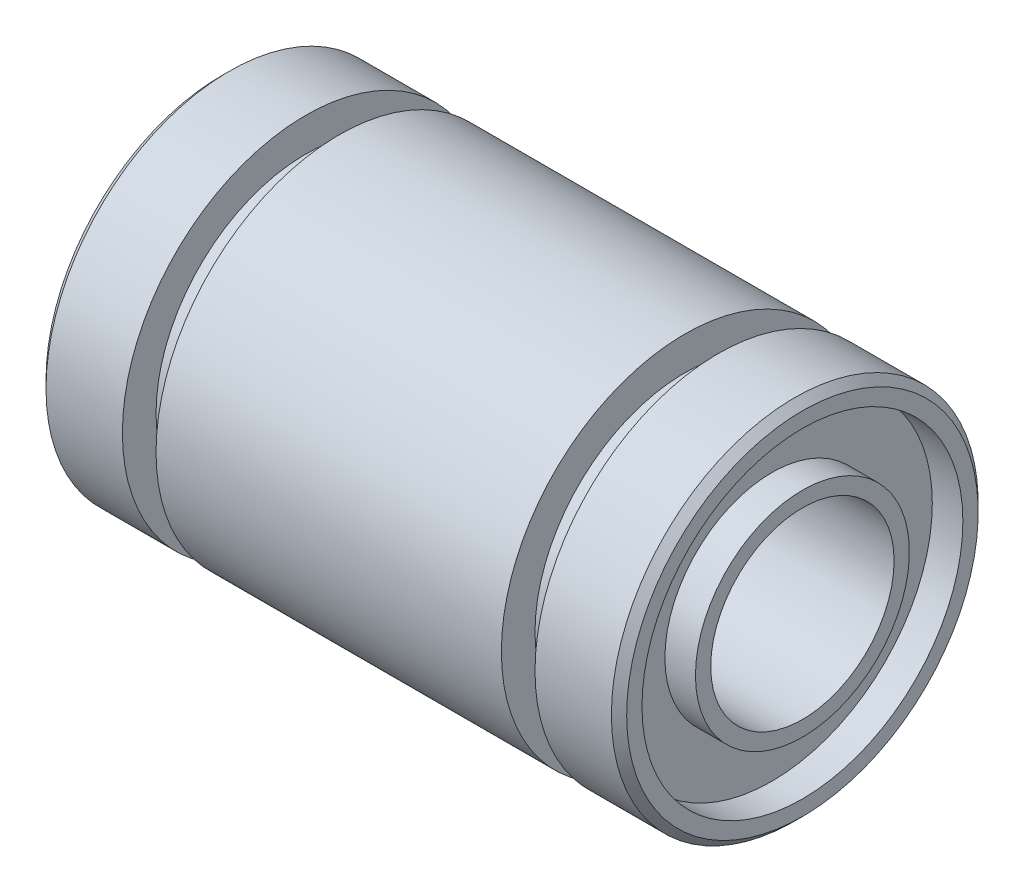
ISO-10303-21;
HEADER;
FILE_DESCRIPTION(('STEP AP214'),'2;1');
FILE_NAME('part.step','',(''),(''),'','','');
FILE_SCHEMA(('AUTOMOTIVE_DESIGN { 1 0 10303 214 1 1 1 1 }'));
ENDSEC;
DATA;
#1=APPLICATION_CONTEXT('core data for automotive mechanical design processes');
#2=APPLICATION_PROTOCOL_DEFINITION('international standard','automotive_design',2000,#1);
#3=PRODUCT_CONTEXT('',#1,'mechanical');
#4=PRODUCT('Part','Part','',(#3));
#5=PRODUCT_RELATED_PRODUCT_CATEGORY('part','',(#4));
#6=PRODUCT_DEFINITION_FORMATION('','',#4);
#7=PRODUCT_DEFINITION_CONTEXT('part definition',#1,'design');
#8=PRODUCT_DEFINITION('design','',#6,#7);
#9=PRODUCT_DEFINITION_SHAPE('','',#8);
#10=(LENGTH_UNIT() NAMED_UNIT(*) SI_UNIT(.MILLI.,.METRE.));
#11=(NAMED_UNIT(*) PLANE_ANGLE_UNIT() SI_UNIT($,.RADIAN.));
#12=(NAMED_UNIT(*) SI_UNIT($,.STERADIAN.) SOLID_ANGLE_UNIT());
#13=UNCERTAINTY_MEASURE_WITH_UNIT(LENGTH_MEASURE(1.E-05),#10,'distance_accuracy_value','');
#14=(GEOMETRIC_REPRESENTATION_CONTEXT(3) GLOBAL_UNCERTAINTY_ASSIGNED_CONTEXT((#13)) GLOBAL_UNIT_ASSIGNED_CONTEXT((#10,
#11,#12)) REPRESENTATION_CONTEXT('',''));
#15=CARTESIAN_POINT('',(0.,0.,0.));
#16=DIRECTION('',(0.,0.,1.));
#17=DIRECTION('',(1.,0.,0.));
#18=AXIS2_PLACEMENT_3D('',#15,#16,#17);
#19=CARTESIAN_POINT('',(9.25000000000001,0.,0.));
#20=DIRECTION('',(-1.,0.,0.));
#21=DIRECTION('',(0.,0.,1.));
#22=AXIS2_PLACEMENT_3D('',#19,#20,#21);
#23=CONICAL_SURFACE('',#22,6.,0.78539816339744);
#24=CARTESIAN_POINT('',(9.50000000000001,0.,0.));
#25=DIRECTION('',(-1.,0.,0.));
#26=DIRECTION('',(0.,0.,1.));
#27=AXIS2_PLACEMENT_3D('',#24,#25,#26);
#28=CIRCLE('',#27,5.75);
#29=CARTESIAN_POINT('',(9.50000000000001,0.,5.75));
#30=VERTEX_POINT('',#29);
#31=EDGE_CURVE('E107',#30,#30,#28,.T.);
#32=ORIENTED_EDGE('',*,*,#31,.T.);
#33=EDGE_LOOP('',(#32));
#34=FACE_BOUND('',#33,.T.);
#35=CARTESIAN_POINT('',(9.25000000000001,0.,0.));
#36=DIRECTION('',(-1.,0.,0.));
#37=DIRECTION('',(0.,0.,1.));
#38=AXIS2_PLACEMENT_3D('',#35,#36,#37);
#39=CIRCLE('',#38,6.);
#40=CARTESIAN_POINT('',(9.25000000000001,0.,6.));
#41=VERTEX_POINT('',#40);
#42=EDGE_CURVE('E10',#41,#41,#39,.T.);
#43=ORIENTED_EDGE('',*,*,#42,.F.);
#44=EDGE_LOOP('',(#43));
#45=FACE_BOUND('',#44,.T.);
#46=ADVANCED_FACE('F37',(#34,#45),#23,.T.);
#47=CARTESIAN_POINT('',(-45.6895053247726,0.,0.));
#48=DIRECTION('',(-1.,0.,0.));
#49=DIRECTION('',(0.,0.,1.));
#50=AXIS2_PLACEMENT_3D('',#47,#48,#49);
#51=CYLINDRICAL_SURFACE('',#50,6.);
#52=CARTESIAN_POINT('',(6.75000000000001,0.,0.));
#53=DIRECTION('',(-1.,0.,0.));
#54=DIRECTION('',(0.,0.,1.));
#55=AXIS2_PLACEMENT_3D('',#52,#53,#54);
#56=CIRCLE('',#55,6.);
#57=CARTESIAN_POINT('',(6.75000000000001,0.,6.));
#58=VERTEX_POINT('',#57);
#59=EDGE_CURVE('E43',#58,#58,#56,.T.);
#60=ORIENTED_EDGE('',*,*,#59,.F.);
#61=EDGE_LOOP('',(#60));
#62=FACE_BOUND('',#61,.T.);
#63=ORIENTED_EDGE('',*,*,#42,.T.);
#64=EDGE_LOOP('',(#63));
#65=FACE_BOUND('',#64,.T.);
#66=ADVANCED_FACE('F125',(#62,#65),#51,.T.);
#67=CARTESIAN_POINT('',(6.75000000000001,0.,0.));
#68=DIRECTION('',(1.,0.,0.));
#69=DIRECTION('',(0.,0.,-1.));
#70=AXIS2_PLACEMENT_3D('',#67,#68,#69);
#71=PLANE('',#70);
#72=CARTESIAN_POINT('',(6.75000000000001,0.,0.));
#73=DIRECTION('',(-1.,0.,0.));
#74=DIRECTION('',(0.,0.,1.));
#75=AXIS2_PLACEMENT_3D('',#72,#73,#74);
#76=CIRCLE('',#75,4.9);
#77=CARTESIAN_POINT('',(6.75000000000001,0.,4.9));
#78=VERTEX_POINT('',#77);
#79=EDGE_CURVE('E47',#78,#78,#76,.T.);
#80=ORIENTED_EDGE('',*,*,#79,.F.);
#81=EDGE_LOOP('',(#80));
#82=FACE_BOUND('',#81,.T.);
#83=ORIENTED_EDGE('',*,*,#59,.T.);
#84=EDGE_LOOP('',(#83));
#85=FACE_BOUND('',#84,.T.);
#86=ADVANCED_FACE('F129',(#82,#85),#71,.F.);
#87=CARTESIAN_POINT('',(-45.6895053247726,0.,0.));
#88=DIRECTION('',(-1.,0.,0.));
#89=DIRECTION('',(0.,0.,1.));
#90=AXIS2_PLACEMENT_3D('',#87,#88,#89);
#91=CYLINDRICAL_SURFACE('',#90,4.9);
#92=CARTESIAN_POINT('',(5.65,0.,0.));
#93=DIRECTION('',(-1.,0.,0.));
#94=DIRECTION('',(0.,0.,1.));
#95=AXIS2_PLACEMENT_3D('',#92,#93,#94);
#96=CIRCLE('',#95,4.9);
#97=CARTESIAN_POINT('',(5.65,0.,4.9));
#98=VERTEX_POINT('',#97);
#99=EDGE_CURVE('E51',#98,#98,#96,.T.);
#100=ORIENTED_EDGE('',*,*,#99,.F.);
#101=EDGE_LOOP('',(#100));
#102=FACE_BOUND('',#101,.T.);
#103=ORIENTED_EDGE('',*,*,#79,.T.);
#104=EDGE_LOOP('',(#103));
#105=FACE_BOUND('',#104,.T.);
#106=ADVANCED_FACE('F134',(#102,#105),#91,.T.);
#107=CARTESIAN_POINT('',(5.65000000000001,0.,0.));
#108=DIRECTION('',(-1.,0.,0.));
#109=DIRECTION('',(0.,0.,1.));
#110=AXIS2_PLACEMENT_3D('',#107,#108,#109);
#111=PLANE('',#110);
#112=CARTESIAN_POINT('',(5.65,0.,0.));
#113=DIRECTION('',(-1.,0.,0.));
#114=DIRECTION('',(0.,0.,1.));
#115=AXIS2_PLACEMENT_3D('',#112,#113,#114);
#116=CIRCLE('',#115,6.);
#117=CARTESIAN_POINT('',(5.65,0.,6.));
#118=VERTEX_POINT('',#117);
#119=EDGE_CURVE('E56',#118,#118,#116,.T.);
#120=ORIENTED_EDGE('',*,*,#119,.F.);
#121=EDGE_LOOP('',(#120));
#122=FACE_BOUND('',#121,.T.);
#123=ORIENTED_EDGE('',*,*,#99,.T.);
#124=EDGE_LOOP('',(#123));
#125=FACE_BOUND('',#124,.T.);
#126=ADVANCED_FACE('F140',(#122,#125),#111,.F.);
#127=CARTESIAN_POINT('',(-45.6895053247726,0.,0.));
#128=DIRECTION('',(-1.,0.,0.));
#129=DIRECTION('',(0.,0.,1.));
#130=AXIS2_PLACEMENT_3D('',#127,#128,#129);
#131=CYLINDRICAL_SURFACE('',#130,6.);
#132=ORIENTED_EDGE('',*,*,#119,.T.);
#133=EDGE_LOOP('',(#132));
#134=FACE_BOUND('',#133,.T.);
#135=CARTESIAN_POINT('',(-5.65,0.,0.));
#136=DIRECTION('',(-1.,0.,0.));
#137=DIRECTION('',(0.,0.,1.));
#138=AXIS2_PLACEMENT_3D('',#135,#136,#137);
#139=CIRCLE('',#138,6.);
#140=CARTESIAN_POINT('',(-5.65,0.,6.));
#141=VERTEX_POINT('',#140);
#142=EDGE_CURVE('E59',#141,#141,#139,.T.);
#143=ORIENTED_EDGE('',*,*,#142,.F.);
#144=EDGE_LOOP('',(#143));
#145=FACE_BOUND('',#144,.T.);
#146=ADVANCED_FACE('F144',(#134,#145),#131,.T.);
#147=CARTESIAN_POINT('',(-5.65,0.,0.));
#148=DIRECTION('',(-1.,0.,0.));
#149=DIRECTION('',(0.,0.,1.));
#150=AXIS2_PLACEMENT_3D('',#147,#148,#149);
#151=PLANE('',#150);
#152=ORIENTED_EDGE('',*,*,#142,.T.);
#153=EDGE_LOOP('',(#152));
#154=FACE_BOUND('',#153,.T.);
#155=CARTESIAN_POINT('',(-5.65,0.,0.));
#156=DIRECTION('',(-1.,0.,0.));
#157=DIRECTION('',(0.,0.,1.));
#158=AXIS2_PLACEMENT_3D('',#155,#156,#157);
#159=CIRCLE('',#158,4.9);
#160=CARTESIAN_POINT('',(-5.65,0.,4.9));
#161=VERTEX_POINT('',#160);
#162=EDGE_CURVE('E62',#161,#161,#159,.T.);
#163=ORIENTED_EDGE('',*,*,#162,.F.);
#164=EDGE_LOOP('',(#163));
#165=FACE_BOUND('',#164,.T.);
#166=ADVANCED_FACE('F148',(#154,#165),#151,.T.);
#167=CARTESIAN_POINT('',(-45.6895053247726,0.,0.));
#168=DIRECTION('',(-1.,0.,0.));
#169=DIRECTION('',(0.,0.,1.));
#170=AXIS2_PLACEMENT_3D('',#167,#168,#169);
#171=CYLINDRICAL_SURFACE('',#170,4.9);
#172=ORIENTED_EDGE('',*,*,#162,.T.);
#173=EDGE_LOOP('',(#172));
#174=FACE_BOUND('',#173,.T.);
#175=CARTESIAN_POINT('',(-6.74999999999999,0.,0.));
#176=DIRECTION('',(-1.,0.,0.));
#177=DIRECTION('',(0.,0.,1.));
#178=AXIS2_PLACEMENT_3D('',#175,#176,#177);
#179=CIRCLE('',#178,4.9);
#180=CARTESIAN_POINT('',(-6.74999999999999,0.,4.9));
#181=VERTEX_POINT('',#180);
#182=EDGE_CURVE('E65',#181,#181,#179,.T.);
#183=ORIENTED_EDGE('',*,*,#182,.F.);
#184=EDGE_LOOP('',(#183));
#185=FACE_BOUND('',#184,.T.);
#186=ADVANCED_FACE('F152',(#174,#185),#171,.T.);
#187=CARTESIAN_POINT('',(-6.75,0.,0.));
#188=DIRECTION('',(1.,0.,0.));
#189=DIRECTION('',(0.,0.,-1.));
#190=AXIS2_PLACEMENT_3D('',#187,#188,#189);
#191=PLANE('',#190);
#192=ORIENTED_EDGE('',*,*,#182,.T.);
#193=EDGE_LOOP('',(#192));
#194=FACE_BOUND('',#193,.T.);
#195=CARTESIAN_POINT('',(-6.74999999999999,0.,0.));
#196=DIRECTION('',(-1.,0.,0.));
#197=DIRECTION('',(0.,0.,1.));
#198=AXIS2_PLACEMENT_3D('',#195,#196,#197);
#199=CIRCLE('',#198,6.);
#200=CARTESIAN_POINT('',(-6.74999999999999,0.,6.));
#201=VERTEX_POINT('',#200);
#202=EDGE_CURVE('E68',#201,#201,#199,.T.);
#203=ORIENTED_EDGE('',*,*,#202,.F.);
#204=EDGE_LOOP('',(#203));
#205=FACE_BOUND('',#204,.T.);
#206=ADVANCED_FACE('F156',(#194,#205),#191,.T.);
#207=CARTESIAN_POINT('',(-45.6895053247726,0.,0.));
#208=DIRECTION('',(-1.,0.,0.));
#209=DIRECTION('',(0.,0.,1.));
#210=AXIS2_PLACEMENT_3D('',#207,#208,#209);
#211=CYLINDRICAL_SURFACE('',#210,6.);
#212=ORIENTED_EDGE('',*,*,#202,.T.);
#213=EDGE_LOOP('',(#212));
#214=FACE_BOUND('',#213,.T.);
#215=CARTESIAN_POINT('',(-9.25,0.,0.));
#216=DIRECTION('',(-1.,0.,0.));
#217=DIRECTION('',(0.,0.,1.));
#218=AXIS2_PLACEMENT_3D('',#215,#216,#217);
#219=CIRCLE('',#218,6.);
#220=CARTESIAN_POINT('',(-9.25,0.,6.));
#221=VERTEX_POINT('',#220);
#222=EDGE_CURVE('E71',#221,#221,#219,.T.);
#223=ORIENTED_EDGE('',*,*,#222,.F.);
#224=EDGE_LOOP('',(#223));
#225=FACE_BOUND('',#224,.T.);
#226=ADVANCED_FACE('F160',(#214,#225),#211,.T.);
#227=CARTESIAN_POINT('',(-9.25,0.,0.));
#228=DIRECTION('',(1.,0.,0.));
#229=DIRECTION('',(0.,0.,-1.));
#230=AXIS2_PLACEMENT_3D('',#227,#228,#229);
#231=CONICAL_SURFACE('',#230,6.,0.785398163397457);
#232=CARTESIAN_POINT('',(-9.49999999999999,0.,0.));
#233=DIRECTION('',(-1.,0.,0.));
#234=DIRECTION('',(0.,0.,1.));
#235=AXIS2_PLACEMENT_3D('',#232,#233,#234);
#236=CIRCLE('',#235,5.75);
#237=CARTESIAN_POINT('',(-9.49999999999999,0.,5.75));
#238=VERTEX_POINT('',#237);
#239=EDGE_CURVE('E74',#238,#238,#236,.T.);
#240=ORIENTED_EDGE('',*,*,#239,.F.);
#241=EDGE_LOOP('',(#240));
#242=FACE_BOUND('',#241,.T.);
#243=ORIENTED_EDGE('',*,*,#222,.T.);
#244=EDGE_LOOP('',(#243));
#245=FACE_BOUND('',#244,.T.);
#246=ADVANCED_FACE('F164',(#242,#245),#231,.T.);
#247=CARTESIAN_POINT('',(-9.49999999999999,0.,0.));
#248=DIRECTION('',(1.,0.,0.));
#249=DIRECTION('',(0.,0.,-1.));
#250=AXIS2_PLACEMENT_3D('',#247,#248,#249);
#251=PLANE('',#250);
#252=CARTESIAN_POINT('',(-9.49999999999999,0.,0.));
#253=DIRECTION('',(-1.,0.,0.));
#254=DIRECTION('',(0.,0.,1.));
#255=AXIS2_PLACEMENT_3D('',#252,#253,#254);
#256=CIRCLE('',#255,5.25);
#257=CARTESIAN_POINT('',(-9.49999999999999,0.,5.25));
#258=VERTEX_POINT('',#257);
#259=EDGE_CURVE('E77',#258,#258,#256,.T.);
#260=ORIENTED_EDGE('',*,*,#259,.F.);
#261=EDGE_LOOP('',(#260));
#262=FACE_BOUND('',#261,.T.);
#263=ORIENTED_EDGE('',*,*,#239,.T.);
#264=EDGE_LOOP('',(#263));
#265=FACE_BOUND('',#264,.T.);
#266=ADVANCED_FACE('F168',(#262,#265),#251,.F.);
#267=CARTESIAN_POINT('',(-45.6895053247726,0.,0.));
#268=DIRECTION('',(-1.,0.,0.));
#269=DIRECTION('',(0.,0.,1.));
#270=AXIS2_PLACEMENT_3D('',#267,#268,#269);
#271=CYLINDRICAL_SURFACE('',#270,5.25);
#272=CARTESIAN_POINT('',(-8.49999999999999,0.,0.));
#273=DIRECTION('',(-1.,0.,0.));
#274=DIRECTION('',(0.,0.,1.));
#275=AXIS2_PLACEMENT_3D('',#272,#273,#274);
#276=CIRCLE('',#275,5.25);
#277=CARTESIAN_POINT('',(-8.49999999999999,0.,5.25));
#278=VERTEX_POINT('',#277);
#279=EDGE_CURVE('E80',#278,#278,#276,.T.);
#280=ORIENTED_EDGE('',*,*,#279,.F.);
#281=EDGE_LOOP('',(#280));
#282=FACE_BOUND('',#281,.T.);
#283=ORIENTED_EDGE('',*,*,#259,.T.);
#284=EDGE_LOOP('',(#283));
#285=FACE_BOUND('',#284,.T.);
#286=ADVANCED_FACE('F172',(#282,#285),#271,.F.);
#287=CARTESIAN_POINT('',(-8.5,0.,0.));
#288=DIRECTION('',(1.,0.,0.));
#289=DIRECTION('',(0.,0.,-1.));
#290=AXIS2_PLACEMENT_3D('',#287,#288,#289);
#291=PLANE('',#290);
#292=CARTESIAN_POINT('',(-8.49999999999999,0.,0.));
#293=DIRECTION('',(-1.,0.,0.));
#294=DIRECTION('',(0.,0.,1.));
#295=AXIS2_PLACEMENT_3D('',#292,#293,#294);
#296=CIRCLE('',#295,3.5);
#297=CARTESIAN_POINT('',(-8.49999999999999,0.,3.5));
#298=VERTEX_POINT('',#297);
#299=EDGE_CURVE('E83',#298,#298,#296,.T.);
#300=ORIENTED_EDGE('',*,*,#299,.F.);
#301=EDGE_LOOP('',(#300));
#302=FACE_BOUND('',#301,.T.);
#303=ORIENTED_EDGE('',*,*,#279,.T.);
#304=EDGE_LOOP('',(#303));
#305=FACE_BOUND('',#304,.T.);
#306=ADVANCED_FACE('F176',(#302,#305),#291,.F.);
#307=CARTESIAN_POINT('',(-45.6895053247726,0.,0.));
#308=DIRECTION('',(-1.,0.,0.));
#309=DIRECTION('',(0.,0.,1.));
#310=AXIS2_PLACEMENT_3D('',#307,#308,#309);
#311=CYLINDRICAL_SURFACE('',#310,3.5);
#312=CARTESIAN_POINT('',(-9.49999999999999,0.,0.));
#313=DIRECTION('',(-1.,0.,0.));
#314=DIRECTION('',(0.,0.,1.));
#315=AXIS2_PLACEMENT_3D('',#312,#313,#314);
#316=CIRCLE('',#315,3.5);
#317=CARTESIAN_POINT('',(-9.49999999999999,0.,3.5));
#318=VERTEX_POINT('',#317);
#319=EDGE_CURVE('E86',#318,#318,#316,.T.);
#320=ORIENTED_EDGE('',*,*,#319,.F.);
#321=EDGE_LOOP('',(#320));
#322=FACE_BOUND('',#321,.T.);
#323=ORIENTED_EDGE('',*,*,#299,.T.);
#324=EDGE_LOOP('',(#323));
#325=FACE_BOUND('',#324,.T.);
#326=ADVANCED_FACE('F180',(#322,#325),#311,.T.);
#327=CARTESIAN_POINT('',(-9.49999999999999,0.,0.));
#328=DIRECTION('',(1.,0.,0.));
#329=DIRECTION('',(0.,0.,-1.));
#330=AXIS2_PLACEMENT_3D('',#327,#328,#329);
#331=PLANE('',#330);
#332=CARTESIAN_POINT('',(-9.49999999999999,0.,0.));
#333=DIRECTION('',(-1.,0.,0.));
#334=DIRECTION('',(0.,0.,1.));
#335=AXIS2_PLACEMENT_3D('',#332,#333,#334);
#336=CIRCLE('',#335,3.);
#337=CARTESIAN_POINT('',(-9.49999999999999,0.,3.));
#338=VERTEX_POINT('',#337);
#339=EDGE_CURVE('E89',#338,#338,#336,.T.);
#340=ORIENTED_EDGE('',*,*,#339,.F.);
#341=EDGE_LOOP('',(#340));
#342=FACE_BOUND('',#341,.T.);
#343=ORIENTED_EDGE('',*,*,#319,.T.);
#344=EDGE_LOOP('',(#343));
#345=FACE_BOUND('',#344,.T.);
#346=ADVANCED_FACE('F184',(#342,#345),#331,.F.);
#347=CARTESIAN_POINT('',(-45.6895053247726,0.,0.));
#348=DIRECTION('',(-1.,0.,0.));
#349=DIRECTION('',(0.,0.,1.));
#350=AXIS2_PLACEMENT_3D('',#347,#348,#349);
#351=CYLINDRICAL_SURFACE('',#350,3.);
#352=CARTESIAN_POINT('',(9.50000000000001,0.,0.));
#353=DIRECTION('',(-1.,0.,0.));
#354=DIRECTION('',(0.,0.,1.));
#355=AXIS2_PLACEMENT_3D('',#352,#353,#354);
#356=CIRCLE('',#355,3.);
#357=CARTESIAN_POINT('',(9.50000000000001,0.,3.));
#358=VERTEX_POINT('',#357);
#359=EDGE_CURVE('E92',#358,#358,#356,.T.);
#360=ORIENTED_EDGE('',*,*,#359,.F.);
#361=EDGE_LOOP('',(#360));
#362=FACE_BOUND('',#361,.T.);
#363=ORIENTED_EDGE('',*,*,#339,.T.);
#364=EDGE_LOOP('',(#363));
#365=FACE_BOUND('',#364,.T.);
#366=ADVANCED_FACE('F188',(#362,#365),#351,.F.);
#367=CARTESIAN_POINT('',(9.50000000000001,0.,0.));
#368=DIRECTION('',(1.,0.,0.));
#369=DIRECTION('',(0.,0.,-1.));
#370=AXIS2_PLACEMENT_3D('',#367,#368,#369);
#371=PLANE('',#370);
#372=ORIENTED_EDGE('',*,*,#359,.T.);
#373=EDGE_LOOP('',(#372));
#374=FACE_BOUND('',#373,.T.);
#375=CARTESIAN_POINT('',(9.50000000000001,0.,0.));
#376=DIRECTION('',(-1.,0.,0.));
#377=DIRECTION('',(0.,0.,1.));
#378=AXIS2_PLACEMENT_3D('',#375,#376,#377);
#379=CIRCLE('',#378,3.5);
#380=CARTESIAN_POINT('',(9.50000000000001,0.,3.5));
#381=VERTEX_POINT('',#380);
#382=EDGE_CURVE('E95',#381,#381,#379,.T.);
#383=ORIENTED_EDGE('',*,*,#382,.F.);
#384=EDGE_LOOP('',(#383));
#385=FACE_BOUND('',#384,.T.);
#386=ADVANCED_FACE('F192',(#374,#385),#371,.T.);
#387=CARTESIAN_POINT('',(-45.6895053247726,0.,0.));
#388=DIRECTION('',(-1.,0.,0.));
#389=DIRECTION('',(0.,0.,1.));
#390=AXIS2_PLACEMENT_3D('',#387,#388,#389);
#391=CYLINDRICAL_SURFACE('',#390,3.5);
#392=ORIENTED_EDGE('',*,*,#382,.T.);
#393=EDGE_LOOP('',(#392));
#394=FACE_BOUND('',#393,.T.);
#395=CARTESIAN_POINT('',(8.50000000000001,0.,0.));
#396=DIRECTION('',(-1.,0.,0.));
#397=DIRECTION('',(0.,0.,1.));
#398=AXIS2_PLACEMENT_3D('',#395,#396,#397);
#399=CIRCLE('',#398,3.5);
#400=CARTESIAN_POINT('',(8.50000000000001,0.,3.5));
#401=VERTEX_POINT('',#400);
#402=EDGE_CURVE('E98',#401,#401,#399,.T.);
#403=ORIENTED_EDGE('',*,*,#402,.F.);
#404=EDGE_LOOP('',(#403));
#405=FACE_BOUND('',#404,.T.);
#406=ADVANCED_FACE('F196',(#394,#405),#391,.T.);
#407=CARTESIAN_POINT('',(8.50000000000001,0.,0.));
#408=DIRECTION('',(1.,0.,0.));
#409=DIRECTION('',(0.,0.,-1.));
#410=AXIS2_PLACEMENT_3D('',#407,#408,#409);
#411=PLANE('',#410);
#412=ORIENTED_EDGE('',*,*,#402,.T.);
#413=EDGE_LOOP('',(#412));
#414=FACE_BOUND('',#413,.T.);
#415=CARTESIAN_POINT('',(8.50000000000001,0.,0.));
#416=DIRECTION('',(-1.,0.,0.));
#417=DIRECTION('',(0.,0.,1.));
#418=AXIS2_PLACEMENT_3D('',#415,#416,#417);
#419=CIRCLE('',#418,5.25);
#420=CARTESIAN_POINT('',(8.50000000000001,0.,5.25));
#421=VERTEX_POINT('',#420);
#422=EDGE_CURVE('E101',#421,#421,#419,.T.);
#423=ORIENTED_EDGE('',*,*,#422,.F.);
#424=EDGE_LOOP('',(#423));
#425=FACE_BOUND('',#424,.T.);
#426=ADVANCED_FACE('F121',(#414,#425),#411,.T.);
#427=CARTESIAN_POINT('',(-45.6895053247726,0.,0.));
#428=DIRECTION('',(-1.,0.,0.));
#429=DIRECTION('',(0.,0.,1.));
#430=AXIS2_PLACEMENT_3D('',#427,#428,#429);
#431=CYLINDRICAL_SURFACE('',#430,5.25);
#432=ORIENTED_EDGE('',*,*,#422,.T.);
#433=EDGE_LOOP('',(#432));
#434=FACE_BOUND('',#433,.T.);
#435=CARTESIAN_POINT('',(9.50000000000001,0.,0.));
#436=DIRECTION('',(-1.,0.,0.));
#437=DIRECTION('',(0.,0.,1.));
#438=AXIS2_PLACEMENT_3D('',#435,#436,#437);
#439=CIRCLE('',#438,5.25);
#440=CARTESIAN_POINT('',(9.50000000000001,0.,5.25));
#441=VERTEX_POINT('',#440);
#442=EDGE_CURVE('E104',#441,#441,#439,.T.);
#443=ORIENTED_EDGE('',*,*,#442,.F.);
#444=EDGE_LOOP('',(#443));
#445=FACE_BOUND('',#444,.T.);
#446=ADVANCED_FACE('F115',(#434,#445),#431,.F.);
#447=CARTESIAN_POINT('',(9.50000000000001,0.,0.));
#448=DIRECTION('',(1.,0.,0.));
#449=DIRECTION('',(0.,0.,-1.));
#450=AXIS2_PLACEMENT_3D('',#447,#448,#449);
#451=PLANE('',#450);
#452=ORIENTED_EDGE('',*,*,#442,.T.);
#453=EDGE_LOOP('',(#452));
#454=FACE_BOUND('',#453,.T.);
#455=ORIENTED_EDGE('',*,*,#31,.F.);
#456=EDGE_LOOP('',(#455));
#457=FACE_BOUND('',#456,.T.);
#458=ADVANCED_FACE('F113',(#454,#457),#451,.T.);
#459=CLOSED_SHELL('',(#46,#66,#86,#106,#126,#146,#166,#186,#206,#226,#246,#266,#286,#306,#326,
#346,#366,#386,#406,#426,#446,#458));
#460=MANIFOLD_SOLID_BREP('B2',#459);
#461=ADVANCED_BREP_SHAPE_REPRESENTATION('',(#18,#460),#14);
#462=SHAPE_DEFINITION_REPRESENTATION(#9,#461);
ENDSEC;
END-ISO-10303-21;
